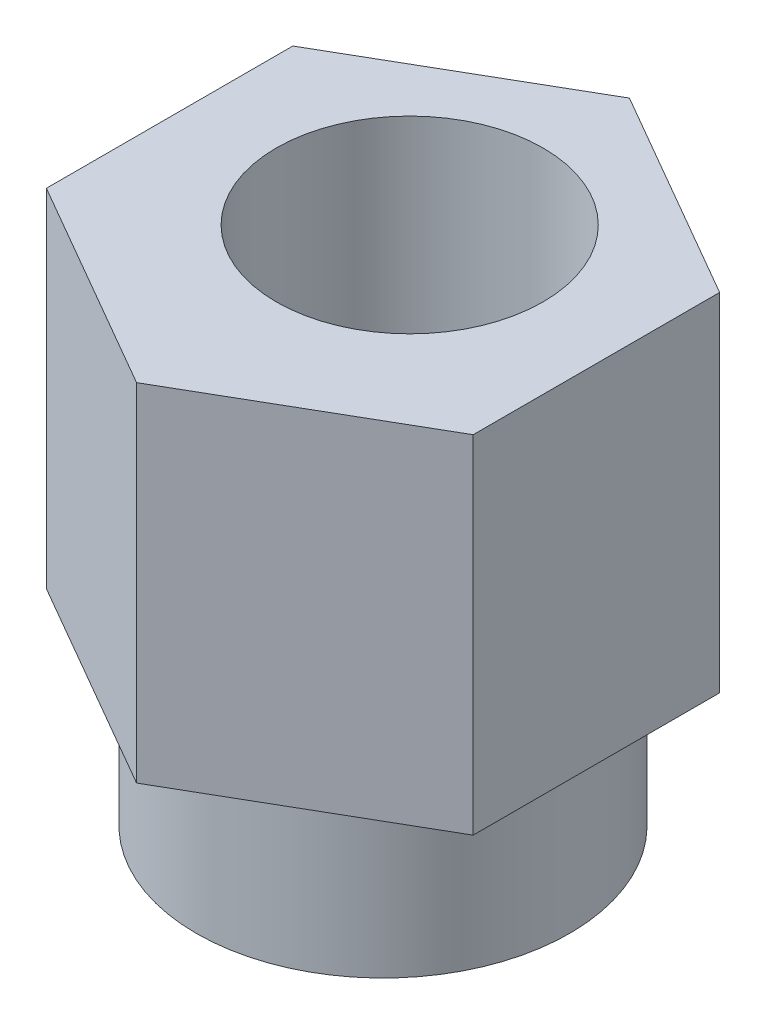
ISO-10303-21;
HEADER;
FILE_DESCRIPTION(('STEP AP214'),'2;1');
FILE_NAME('part.step','',(''),(''),'','','');
FILE_SCHEMA(('AUTOMOTIVE_DESIGN { 1 0 10303 214 1 1 1 1 }'));
ENDSEC;
DATA;
#1=APPLICATION_CONTEXT('core data for automotive mechanical design processes');
#2=APPLICATION_PROTOCOL_DEFINITION('international standard','automotive_design',2000,#1);
#3=PRODUCT_CONTEXT('',#1,'mechanical');
#4=PRODUCT('Part','Part','',(#3));
#5=PRODUCT_RELATED_PRODUCT_CATEGORY('part','',(#4));
#6=PRODUCT_DEFINITION_FORMATION('','',#4);
#7=PRODUCT_DEFINITION_CONTEXT('part definition',#1,'design');
#8=PRODUCT_DEFINITION('design','',#6,#7);
#9=PRODUCT_DEFINITION_SHAPE('','',#8);
#10=(LENGTH_UNIT() NAMED_UNIT(*) SI_UNIT(.MILLI.,.METRE.));
#11=(NAMED_UNIT(*) PLANE_ANGLE_UNIT() SI_UNIT($,.RADIAN.));
#12=(NAMED_UNIT(*) SI_UNIT($,.STERADIAN.) SOLID_ANGLE_UNIT());
#13=UNCERTAINTY_MEASURE_WITH_UNIT(LENGTH_MEASURE(1.E-05),#10,'distance_accuracy_value','');
#14=(GEOMETRIC_REPRESENTATION_CONTEXT(3) GLOBAL_UNCERTAINTY_ASSIGNED_CONTEXT((#13)) GLOBAL_UNIT_ASSIGNED_CONTEXT((#10,
#11,#12)) REPRESENTATION_CONTEXT('',''));
#15=CARTESIAN_POINT('',(0.,0.,0.));
#16=DIRECTION('',(0.,0.,1.));
#17=DIRECTION('',(1.,0.,0.));
#18=AXIS2_PLACEMENT_3D('',#15,#16,#17);
#19=CARTESIAN_POINT('',(-3.99999999999995,6.5,2.30940107675854));
#20=DIRECTION('',(0.499999999999995,0.,-0.866025403784442));
#21=DIRECTION('',(-0.866025403784442,0.,-0.499999999999995));
#22=AXIS2_PLACEMENT_3D('',#19,#20,#21);
#23=PLANE('',#22);
#24=DIRECTION('',(0.866025403784441,0.,0.499999999999995));
#25=VECTOR('',#24,1.);
#26=CARTESIAN_POINT('',(-3.99999999999995,0.,2.30940107675854));
#27=LINE('',#26,#25);
#28=CARTESIAN_POINT('',(-3.99999999999995,0.,2.30940107675854));
#29=VERTEX_POINT('',#28);
#30=CARTESIAN_POINT('',(0.,0.,4.61880215351698));
#31=VERTEX_POINT('',#30);
#32=EDGE_CURVE('E119',#29,#31,#27,.T.);
#33=ORIENTED_EDGE('',*,*,#32,.T.);
#34=DIRECTION('',(0.,-1.,0.));
#35=VECTOR('',#34,1.);
#36=CARTESIAN_POINT('',(0.,6.5,4.61880215351698));
#37=LINE('',#36,#35);
#38=CARTESIAN_POINT('',(0.,6.5,4.61880215351698));
#39=VERTEX_POINT('',#38);
#40=EDGE_CURVE('E11',#39,#31,#37,.T.);
#41=ORIENTED_EDGE('',*,*,#40,.F.);
#42=DIRECTION('',(0.866025403784441,0.,0.499999999999995));
#43=VECTOR('',#42,1.);
#44=CARTESIAN_POINT('',(-3.99999999999995,6.5,2.30940107675854));
#45=LINE('',#44,#43);
#46=CARTESIAN_POINT('',(-3.99999999999995,6.5,2.30940107675854));
#47=VERTEX_POINT('',#46);
#48=EDGE_CURVE('E130',#47,#39,#45,.T.);
#49=ORIENTED_EDGE('',*,*,#48,.F.);
#50=DIRECTION('',(0.,-1.,0.));
#51=VECTOR('',#50,1.);
#52=CARTESIAN_POINT('',(-3.99999999999995,6.5,2.30940107675854));
#53=LINE('',#52,#51);
#54=EDGE_CURVE('E115',#47,#29,#53,.T.);
#55=ORIENTED_EDGE('',*,*,#54,.T.);
#56=EDGE_LOOP('',(#33,#41,#49,#55));
#57=FACE_BOUND('',#56,.T.);
#58=ADVANCED_FACE('F35',(#57),#23,.F.);
#59=CARTESIAN_POINT('',(0.,6.5,4.61880215351698));
#60=DIRECTION('',(-0.500000000000001,0.,-0.866025403784438));
#61=DIRECTION('',(-0.866025403784438,0.,0.500000000000001));
#62=AXIS2_PLACEMENT_3D('',#59,#60,#61);
#63=PLANE('',#62);
#64=DIRECTION('',(0.866025403784438,0.,-0.500000000000001));
#65=VECTOR('',#64,1.);
#66=CARTESIAN_POINT('',(0.,0.,4.61880215351698));
#67=LINE('',#66,#65);
#68=CARTESIAN_POINT('',(3.99999999999999,0.,2.30940107675848));
#69=VERTEX_POINT('',#68);
#70=EDGE_CURVE('E122',#31,#69,#67,.T.);
#71=ORIENTED_EDGE('',*,*,#70,.T.);
#72=DIRECTION('',(0.,-1.,0.));
#73=VECTOR('',#72,1.);
#74=CARTESIAN_POINT('',(3.99999999999999,6.5,2.30940107675848));
#75=LINE('',#74,#73);
#76=CARTESIAN_POINT('',(3.99999999999999,6.5,2.30940107675848));
#77=VERTEX_POINT('',#76);
#78=EDGE_CURVE('E43',#77,#69,#75,.T.);
#79=ORIENTED_EDGE('',*,*,#78,.F.);
#80=DIRECTION('',(0.866025403784438,0.,-0.500000000000001));
#81=VECTOR('',#80,1.);
#82=CARTESIAN_POINT('',(0.,6.5,4.61880215351698));
#83=LINE('',#82,#81);
#84=EDGE_CURVE('E88',#39,#77,#83,.T.);
#85=ORIENTED_EDGE('',*,*,#84,.F.);
#86=ORIENTED_EDGE('',*,*,#40,.T.);
#87=EDGE_LOOP('',(#71,#79,#85,#86));
#88=FACE_BOUND('',#87,.T.);
#89=ADVANCED_FACE('F156',(#88),#63,.F.);
#90=CARTESIAN_POINT('',(3.99999999999999,6.5,2.30940107675848));
#91=DIRECTION('',(-1.,0.,0.));
#92=DIRECTION('',(0.,0.,1.));
#93=AXIS2_PLACEMENT_3D('',#90,#91,#92);
#94=PLANE('',#93);
#95=DIRECTION('',(0.,0.,-1.));
#96=VECTOR('',#95,1.);
#97=CARTESIAN_POINT('',(3.99999999999999,0.,2.30940107675848));
#98=LINE('',#97,#96);
#99=CARTESIAN_POINT('',(3.99999999999997,0.,-2.30940107675851));
#100=VERTEX_POINT('',#99);
#101=EDGE_CURVE('E125',#69,#100,#98,.T.);
#102=ORIENTED_EDGE('',*,*,#101,.T.);
#103=DIRECTION('',(0.,-1.,0.));
#104=VECTOR('',#103,1.);
#105=CARTESIAN_POINT('',(3.99999999999997,6.5,-2.30940107675851));
#106=LINE('',#105,#104);
#107=CARTESIAN_POINT('',(3.99999999999997,6.5,-2.30940107675851));
#108=VERTEX_POINT('',#107);
#109=EDGE_CURVE('E110',#108,#100,#106,.T.);
#110=ORIENTED_EDGE('',*,*,#109,.F.);
#111=DIRECTION('',(0.,0.,-1.));
#112=VECTOR('',#111,1.);
#113=CARTESIAN_POINT('',(3.99999999999999,6.5,2.30940107675848));
#114=LINE('',#113,#112);
#115=EDGE_CURVE('E101',#77,#108,#114,.T.);
#116=ORIENTED_EDGE('',*,*,#115,.F.);
#117=ORIENTED_EDGE('',*,*,#78,.T.);
#118=EDGE_LOOP('',(#102,#110,#116,#117));
#119=FACE_BOUND('',#118,.T.);
#120=ADVANCED_FACE('F136',(#119),#94,.F.);
#121=CARTESIAN_POINT('',(3.99999999999997,6.5,-2.30940107675851));
#122=DIRECTION('',(-0.499999999999995,0.,0.866025403784441));
#123=DIRECTION('',(0.866025403784441,0.,0.499999999999995));
#124=AXIS2_PLACEMENT_3D('',#121,#122,#123);
#125=PLANE('',#124);
#126=DIRECTION('',(-0.866025403784441,0.,-0.499999999999995));
#127=VECTOR('',#126,1.);
#128=CARTESIAN_POINT('',(3.99999999999997,0.,-2.30940107675851));
#129=LINE('',#128,#127);
#130=CARTESIAN_POINT('',(0.,0.,-4.61880215351698));
#131=VERTEX_POINT('',#130);
#132=EDGE_CURVE('E109',#100,#131,#129,.T.);
#133=ORIENTED_EDGE('',*,*,#132,.T.);
#134=DIRECTION('',(0.,-1.,0.));
#135=VECTOR('',#134,1.);
#136=CARTESIAN_POINT('',(0.,6.5,-4.61880215351698));
#137=LINE('',#136,#135);
#138=CARTESIAN_POINT('',(0.,6.5,-4.61880215351698));
#139=VERTEX_POINT('',#138);
#140=EDGE_CURVE('E106',#139,#131,#137,.T.);
#141=ORIENTED_EDGE('',*,*,#140,.F.);
#142=DIRECTION('',(-0.866025403784441,0.,-0.499999999999995));
#143=VECTOR('',#142,1.);
#144=CARTESIAN_POINT('',(3.99999999999997,6.5,-2.30940107675851));
#145=LINE('',#144,#143);
#146=EDGE_CURVE('E95',#108,#139,#145,.T.);
#147=ORIENTED_EDGE('',*,*,#146,.F.);
#148=ORIENTED_EDGE('',*,*,#109,.T.);
#149=EDGE_LOOP('',(#133,#141,#147,#148));
#150=FACE_BOUND('',#149,.T.);
#151=ADVANCED_FACE('F107',(#150),#125,.F.);
#152=CARTESIAN_POINT('',(0.,6.5,-4.61880215351698));
#153=DIRECTION('',(0.500000000000007,0.,0.866025403784434));
#154=DIRECTION('',(0.866025403784435,0.,-0.500000000000007));
#155=AXIS2_PLACEMENT_3D('',#152,#153,#154);
#156=PLANE('',#155);
#157=DIRECTION('',(-0.866025403784434,0.,0.500000000000007));
#158=VECTOR('',#157,1.);
#159=CARTESIAN_POINT('',(0.,0.,-4.61880215351698));
#160=LINE('',#159,#158);
#161=CARTESIAN_POINT('',(-4.,0.,-2.30940107675845));
#162=VERTEX_POINT('',#161);
#163=EDGE_CURVE('E74',#131,#162,#160,.T.);
#164=ORIENTED_EDGE('',*,*,#163,.T.);
#165=DIRECTION('',(0.,-1.,0.));
#166=VECTOR('',#165,1.);
#167=CARTESIAN_POINT('',(-4.,6.5,-2.30940107675845));
#168=LINE('',#167,#166);
#169=CARTESIAN_POINT('',(-4.,6.5,-2.30940107675845));
#170=VERTEX_POINT('',#169);
#171=EDGE_CURVE('E111',#170,#162,#168,.T.);
#172=ORIENTED_EDGE('',*,*,#171,.F.);
#173=DIRECTION('',(-0.866025403784434,0.,0.500000000000007));
#174=VECTOR('',#173,1.);
#175=CARTESIAN_POINT('',(0.,6.5,-4.61880215351698));
#176=LINE('',#175,#174);
#177=EDGE_CURVE('E99',#139,#170,#176,.T.);
#178=ORIENTED_EDGE('',*,*,#177,.F.);
#179=ORIENTED_EDGE('',*,*,#140,.T.);
#180=EDGE_LOOP('',(#164,#172,#178,#179));
#181=FACE_BOUND('',#180,.T.);
#182=ADVANCED_FACE('F113',(#181),#156,.F.);
#183=CARTESIAN_POINT('',(-4.,6.5,-2.30940107675845));
#184=DIRECTION('',(1.,0.,0.));
#185=DIRECTION('',(0.,0.,-1.));
#186=AXIS2_PLACEMENT_3D('',#183,#184,#185);
#187=PLANE('',#186);
#188=DIRECTION('',(0.,0.,1.));
#189=VECTOR('',#188,1.);
#190=CARTESIAN_POINT('',(-4.,0.,-2.30940107675845));
#191=LINE('',#190,#189);
#192=EDGE_CURVE('E80',#162,#29,#191,.T.);
#193=ORIENTED_EDGE('',*,*,#192,.T.);
#194=ORIENTED_EDGE('',*,*,#54,.F.);
#195=DIRECTION('',(0.,0.,1.));
#196=VECTOR('',#195,1.);
#197=CARTESIAN_POINT('',(-4.,6.5,-2.30940107675845));
#198=LINE('',#197,#196);
#199=EDGE_CURVE('E51',#170,#47,#198,.T.);
#200=ORIENTED_EDGE('',*,*,#199,.F.);
#201=ORIENTED_EDGE('',*,*,#171,.T.);
#202=EDGE_LOOP('',(#193,#194,#200,#201));
#203=FACE_BOUND('',#202,.T.);
#204=ADVANCED_FACE('F143',(#203),#187,.F.);
#205=CARTESIAN_POINT('',(0.,6.5,0.));
#206=DIRECTION('',(0.,1.,0.));
#207=DIRECTION('',(0.,0.,1.));
#208=AXIS2_PLACEMENT_3D('',#205,#206,#207);
#209=PLANE('',#208);
#210=CARTESIAN_POINT('',(0.,6.5,-0.5));
#211=DIRECTION('',(0.,1.,0.));
#212=DIRECTION('',(0.,0.,1.));
#213=AXIS2_PLACEMENT_3D('',#210,#211,#212);
#214=CIRCLE('',#213,2.5);
#215=CARTESIAN_POINT('',(0.,6.5,2.));
#216=VERTEX_POINT('',#215);
#217=EDGE_CURVE('E230',#216,#216,#214,.T.);
#218=ORIENTED_EDGE('',*,*,#217,.F.);
#219=EDGE_LOOP('',(#218));
#220=FACE_BOUND('',#219,.T.);
#221=ORIENTED_EDGE('',*,*,#48,.T.);
#222=ORIENTED_EDGE('',*,*,#84,.T.);
#223=ORIENTED_EDGE('',*,*,#115,.T.);
#224=ORIENTED_EDGE('',*,*,#146,.T.);
#225=ORIENTED_EDGE('',*,*,#177,.T.);
#226=ORIENTED_EDGE('',*,*,#199,.T.);
#227=EDGE_LOOP('',(#221,#222,#223,#224,#225,#226));
#228=FACE_BOUND('',#227,.T.);
#229=ADVANCED_FACE('F97',(#220,#228),#209,.T.);
#230=CARTESIAN_POINT('',(0.,0.,0.));
#231=DIRECTION('',(0.,1.,0.));
#232=DIRECTION('',(0.,0.,1.));
#233=AXIS2_PLACEMENT_3D('',#230,#231,#232);
#234=PLANE('',#233);
#235=CARTESIAN_POINT('',(0.,0.,0.));
#236=DIRECTION('',(0.,1.,0.));
#237=DIRECTION('',(0.,0.,1.));
#238=AXIS2_PLACEMENT_3D('',#235,#236,#237);
#239=CIRCLE('',#238,3.5);
#240=CARTESIAN_POINT('',(0.,0.,3.5));
#241=VERTEX_POINT('',#240);
#242=EDGE_CURVE('E232',#241,#241,#239,.T.);
#243=ORIENTED_EDGE('',*,*,#242,.T.);
#244=EDGE_LOOP('',(#243));
#245=FACE_BOUND('',#244,.T.);
#246=ORIENTED_EDGE('',*,*,#32,.F.);
#247=ORIENTED_EDGE('',*,*,#192,.F.);
#248=ORIENTED_EDGE('',*,*,#163,.F.);
#249=ORIENTED_EDGE('',*,*,#132,.F.);
#250=ORIENTED_EDGE('',*,*,#101,.F.);
#251=ORIENTED_EDGE('',*,*,#70,.F.);
#252=EDGE_LOOP('',(#246,#247,#248,#249,#250,#251));
#253=FACE_BOUND('',#252,.T.);
#254=ADVANCED_FACE('F139',(#245,#253),#234,.F.);
#255=CARTESIAN_POINT('',(0.,-3.,0.));
#256=DIRECTION('',(0.,1.,0.));
#257=DIRECTION('',(0.,0.,1.));
#258=AXIS2_PLACEMENT_3D('',#255,#256,#257);
#259=CYLINDRICAL_SURFACE('',#258,3.5);
#260=CARTESIAN_POINT('',(0.,-3.,0.));
#261=DIRECTION('',(0.,1.,0.));
#262=DIRECTION('',(0.,0.,1.));
#263=AXIS2_PLACEMENT_3D('',#260,#261,#262);
#264=CIRCLE('',#263,3.5);
#265=CARTESIAN_POINT('',(0.,-3.,3.5));
#266=VERTEX_POINT('',#265);
#267=EDGE_CURVE('E123',#266,#266,#264,.T.);
#268=ORIENTED_EDGE('',*,*,#267,.T.);
#269=EDGE_LOOP('',(#268));
#270=FACE_BOUND('',#269,.T.);
#271=ORIENTED_EDGE('',*,*,#242,.F.);
#272=EDGE_LOOP('',(#271));
#273=FACE_BOUND('',#272,.T.);
#274=ADVANCED_FACE('F187',(#270,#273),#259,.T.);
#275=CARTESIAN_POINT('',(0.,-3.,0.));
#276=DIRECTION('',(0.,1.,0.));
#277=DIRECTION('',(0.,0.,1.));
#278=AXIS2_PLACEMENT_3D('',#275,#276,#277);
#279=PLANE('',#278);
#280=CARTESIAN_POINT('',(0.,-3.,-0.5));
#281=DIRECTION('',(0.,1.,0.));
#282=DIRECTION('',(0.,0.,1.));
#283=AXIS2_PLACEMENT_3D('',#280,#281,#282);
#284=CIRCLE('',#283,2.5);
#285=CARTESIAN_POINT('',(0.,-3.,2.));
#286=VERTEX_POINT('',#285);
#287=EDGE_CURVE('E227',#286,#286,#284,.T.);
#288=ORIENTED_EDGE('',*,*,#287,.T.);
#289=EDGE_LOOP('',(#288));
#290=FACE_BOUND('',#289,.T.);
#291=ORIENTED_EDGE('',*,*,#267,.F.);
#292=EDGE_LOOP('',(#291));
#293=FACE_BOUND('',#292,.T.);
#294=ADVANCED_FACE('F195',(#290,#293),#279,.F.);
#295=CARTESIAN_POINT('',(0.,-3.,-0.5));
#296=DIRECTION('',(0.,1.,0.));
#297=DIRECTION('',(0.,0.,1.));
#298=AXIS2_PLACEMENT_3D('',#295,#296,#297);
#299=CYLINDRICAL_SURFACE('',#298,2.5);
#300=ORIENTED_EDGE('',*,*,#287,.F.);
#301=EDGE_LOOP('',(#300));
#302=FACE_BOUND('',#301,.T.);
#303=ORIENTED_EDGE('',*,*,#217,.T.);
#304=EDGE_LOOP('',(#303));
#305=FACE_BOUND('',#304,.T.);
#306=ADVANCED_FACE('F204',(#302,#305),#299,.F.);
#307=CLOSED_SHELL('',(#58,#89,#120,#151,#182,#204,#229,#254,#274,#294,#306));
#308=MANIFOLD_SOLID_BREP('B2',#307);
#309=ADVANCED_BREP_SHAPE_REPRESENTATION('',(#18,#308),#14);
#310=SHAPE_DEFINITION_REPRESENTATION(#9,#309);
ENDSEC;
END-ISO-10303-21;
